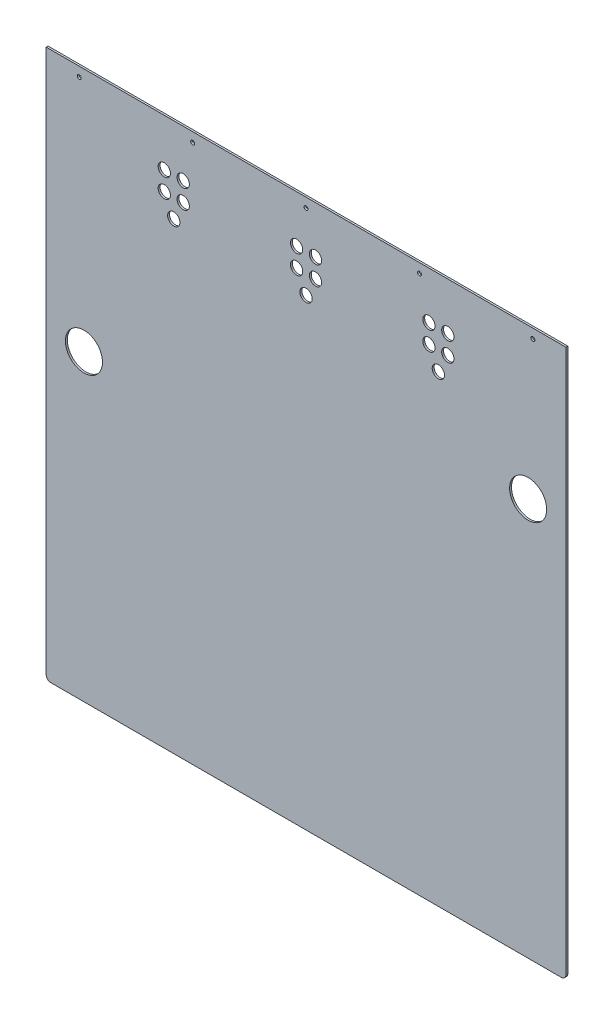
ISO-10303-21;
HEADER;
FILE_DESCRIPTION(('STEP AP214'),'2;1');
FILE_NAME('part.step','',(''),(''),'','','');
FILE_SCHEMA(('AUTOMOTIVE_DESIGN { 1 0 10303 214 1 1 1 1 }'));
ENDSEC;
DATA;
#1=APPLICATION_CONTEXT('core data for automotive mechanical design processes');
#2=APPLICATION_PROTOCOL_DEFINITION('international standard','automotive_design',2000,#1);
#3=PRODUCT_CONTEXT('',#1,'mechanical');
#4=PRODUCT('Part','Part','',(#3));
#5=PRODUCT_RELATED_PRODUCT_CATEGORY('part','',(#4));
#6=PRODUCT_DEFINITION_FORMATION('','',#4);
#7=PRODUCT_DEFINITION_CONTEXT('part definition',#1,'design');
#8=PRODUCT_DEFINITION('design','',#6,#7);
#9=PRODUCT_DEFINITION_SHAPE('','',#8);
#10=(LENGTH_UNIT() NAMED_UNIT(*) SI_UNIT(.MILLI.,.METRE.));
#11=(NAMED_UNIT(*) PLANE_ANGLE_UNIT() SI_UNIT($,.RADIAN.));
#12=(NAMED_UNIT(*) SI_UNIT($,.STERADIAN.) SOLID_ANGLE_UNIT());
#13=UNCERTAINTY_MEASURE_WITH_UNIT(LENGTH_MEASURE(1.E-05),#10,'distance_accuracy_value','');
#14=(GEOMETRIC_REPRESENTATION_CONTEXT(3) GLOBAL_UNCERTAINTY_ASSIGNED_CONTEXT((#13)) GLOBAL_UNIT_ASSIGNED_CONTEXT((#10,
#11,#12)) REPRESENTATION_CONTEXT('',''));
#15=CARTESIAN_POINT('',(0.,0.,0.));
#16=DIRECTION('',(0.,0.,1.));
#17=DIRECTION('',(1.,0.,0.));
#18=AXIS2_PLACEMENT_3D('',#15,#16,#17);
#19=CARTESIAN_POINT('',(0.,0.,-2.));
#20=DIRECTION('',(0.,0.,-1.));
#21=DIRECTION('',(-1.,0.,0.));
#22=AXIS2_PLACEMENT_3D('',#19,#20,#21);
#23=PLANE('',#22);
#24=CARTESIAN_POINT('',(140.,199.999999999999,-2.));
#25=DIRECTION('',(0.,0.,-1.));
#26=DIRECTION('',(-1.,0.,0.));
#27=AXIS2_PLACEMENT_3D('',#24,#25,#26);
#28=CIRCLE('',#27,6.49999999999999);
#29=CARTESIAN_POINT('',(133.5,199.999999999999,-2.));
#30=VERTEX_POINT('',#29);
#31=EDGE_CURVE('E505',#30,#30,#28,.T.);
#32=ORIENTED_EDGE('',*,*,#31,.F.);
#33=EDGE_LOOP('',(#32));
#34=FACE_BOUND('',#33,.T.);
#35=CARTESIAN_POINT('',(-140.,200.,-2.));
#36=DIRECTION('',(0.,0.,-1.));
#37=DIRECTION('',(-1.,0.,0.));
#38=AXIS2_PLACEMENT_3D('',#35,#36,#37);
#39=CIRCLE('',#38,6.49999999999999);
#40=CARTESIAN_POINT('',(-146.5,200.,-2.));
#41=VERTEX_POINT('',#40);
#42=EDGE_CURVE('E509',#41,#41,#39,.T.);
#43=ORIENTED_EDGE('',*,*,#42,.F.);
#44=EDGE_LOOP('',(#43));
#45=FACE_BOUND('',#44,.T.);
#46=CARTESIAN_POINT('',(0.,200.,-2.));
#47=DIRECTION('',(0.,0.,-1.));
#48=DIRECTION('',(-1.,0.,0.));
#49=AXIS2_PLACEMENT_3D('',#46,#47,#48);
#50=CIRCLE('',#49,6.5);
#51=CARTESIAN_POINT('',(-6.49999999999995,200.,-2.));
#52=VERTEX_POINT('',#51);
#53=EDGE_CURVE('E517',#52,#52,#50,.T.);
#54=ORIENTED_EDGE('',*,*,#53,.F.);
#55=EDGE_LOOP('',(#54));
#56=FACE_BOUND('',#55,.T.);
#57=CARTESIAN_POINT('',(-130.,220.,-2.));
#58=DIRECTION('',(0.,0.,-1.));
#59=DIRECTION('',(-1.,0.,0.));
#60=AXIS2_PLACEMENT_3D('',#57,#58,#59);
#61=CIRCLE('',#60,6.50000000000002);
#62=CARTESIAN_POINT('',(-136.5,220.,-2.));
#63=VERTEX_POINT('',#62);
#64=EDGE_CURVE('E558',#63,#63,#61,.F.);
#65=ORIENTED_EDGE('',*,*,#64,.T.);
#66=EDGE_LOOP('',(#65));
#67=FACE_BOUND('',#66,.T.);
#68=CARTESIAN_POINT('',(9.99999999999999,220.,-2.));
#69=DIRECTION('',(0.,0.,-1.));
#70=DIRECTION('',(-1.,0.,0.));
#71=AXIS2_PLACEMENT_3D('',#68,#69,#70);
#72=CIRCLE('',#71,6.50000000000001);
#73=CARTESIAN_POINT('',(3.49999999999999,220.,-2.));
#74=VERTEX_POINT('',#73);
#75=EDGE_CURVE('E552',#74,#74,#72,.F.);
#76=ORIENTED_EDGE('',*,*,#75,.T.);
#77=EDGE_LOOP('',(#76));
#78=FACE_BOUND('',#77,.T.);
#79=CARTESIAN_POINT('',(150.,220.,-2.));
#80=DIRECTION('',(0.,0.,-1.));
#81=DIRECTION('',(-1.,0.,0.));
#82=AXIS2_PLACEMENT_3D('',#79,#80,#81);
#83=CIRCLE('',#82,6.49999999999999);
#84=CARTESIAN_POINT('',(143.5,220.,-2.));
#85=VERTEX_POINT('',#84);
#86=EDGE_CURVE('E573',#85,#85,#83,.F.);
#87=ORIENTED_EDGE('',*,*,#86,.T.);
#88=EDGE_LOOP('',(#87));
#89=FACE_BOUND('',#88,.T.);
#90=CARTESIAN_POINT('',(-130.,240.,-2.));
#91=DIRECTION('',(0.,0.,-1.));
#92=DIRECTION('',(-1.,0.,0.));
#93=AXIS2_PLACEMENT_3D('',#90,#91,#92);
#94=CIRCLE('',#93,6.50000000000002);
#95=CARTESIAN_POINT('',(-136.5,240.,-2.));
#96=VERTEX_POINT('',#95);
#97=EDGE_CURVE('E534',#96,#96,#94,.F.);
#98=ORIENTED_EDGE('',*,*,#97,.T.);
#99=EDGE_LOOP('',(#98));
#100=FACE_BOUND('',#99,.T.);
#101=CARTESIAN_POINT('',(9.99999999999999,240.,-2.));
#102=DIRECTION('',(0.,0.,1.));
#103=DIRECTION('',(1.,0.,0.));
#104=AXIS2_PLACEMENT_3D('',#101,#102,#103);
#105=CIRCLE('',#104,6.50000000000001);
#106=CARTESIAN_POINT('',(16.5,240.,-2.));
#107=VERTEX_POINT('',#106);
#108=EDGE_CURVE('E523',#107,#107,#105,.T.);
#109=ORIENTED_EDGE('',*,*,#108,.T.);
#110=EDGE_LOOP('',(#109));
#111=FACE_BOUND('',#110,.T.);
#112=CARTESIAN_POINT('',(150.,240.,-2.));
#113=DIRECTION('',(0.,0.,-1.));
#114=DIRECTION('',(-1.,0.,0.));
#115=AXIS2_PLACEMENT_3D('',#112,#113,#114);
#116=CIRCLE('',#115,6.49999999999999);
#117=CARTESIAN_POINT('',(143.5,240.,-2.));
#118=VERTEX_POINT('',#117);
#119=EDGE_CURVE('E590',#118,#118,#116,.F.);
#120=ORIENTED_EDGE('',*,*,#119,.T.);
#121=EDGE_LOOP('',(#120));
#122=FACE_BOUND('',#121,.T.);
#123=CARTESIAN_POINT('',(-120.,280.,-2.));
#124=DIRECTION('',(0.,0.,-1.));
#125=DIRECTION('',(-1.,0.,0.));
#126=AXIS2_PLACEMENT_3D('',#123,#124,#125);
#127=CIRCLE('',#126,2.1);
#128=CARTESIAN_POINT('',(-122.1,280.,-2.));
#129=VERTEX_POINT('',#128);
#130=EDGE_CURVE('E593',#129,#129,#127,.F.);
#131=ORIENTED_EDGE('',*,*,#130,.T.);
#132=EDGE_LOOP('',(#131));
#133=FACE_BOUND('',#132,.T.);
#134=CARTESIAN_POINT('',(-240.,280.,-2.));
#135=DIRECTION('',(0.,0.,-1.));
#136=DIRECTION('',(-1.,0.,0.));
#137=AXIS2_PLACEMENT_3D('',#134,#135,#136);
#138=CIRCLE('',#137,2.09999999999999);
#139=CARTESIAN_POINT('',(-242.1,280.,-2.));
#140=VERTEX_POINT('',#139);
#141=EDGE_CURVE('E612',#140,#140,#138,.F.);
#142=ORIENTED_EDGE('',*,*,#141,.T.);
#143=EDGE_LOOP('',(#142));
#144=FACE_BOUND('',#143,.T.);
#145=CARTESIAN_POINT('',(240.,280.,-2.));
#146=DIRECTION('',(0.,0.,-1.));
#147=DIRECTION('',(-1.,0.,0.));
#148=AXIS2_PLACEMENT_3D('',#145,#146,#147);
#149=CIRCLE('',#148,2.09999999999999);
#150=CARTESIAN_POINT('',(237.9,280.,-2.));
#151=VERTEX_POINT('',#150);
#152=EDGE_CURVE('E606',#151,#151,#149,.F.);
#153=ORIENTED_EDGE('',*,*,#152,.T.);
#154=EDGE_LOOP('',(#153));
#155=FACE_BOUND('',#154,.T.);
#156=CARTESIAN_POINT('',(120.,280.,-2.));
#157=DIRECTION('',(0.,0.,-1.));
#158=DIRECTION('',(-1.,0.,0.));
#159=AXIS2_PLACEMENT_3D('',#156,#157,#158);
#160=CIRCLE('',#159,2.1);
#161=CARTESIAN_POINT('',(117.9,280.,-2.));
#162=VERTEX_POINT('',#161);
#163=EDGE_CURVE('E600',#162,#162,#160,.F.);
#164=ORIENTED_EDGE('',*,*,#163,.T.);
#165=EDGE_LOOP('',(#164));
#166=FACE_BOUND('',#165,.T.);
#167=CARTESIAN_POINT('',(0.,280.,-2.));
#168=DIRECTION('',(0.,0.,-1.));
#169=DIRECTION('',(-1.,0.,0.));
#170=AXIS2_PLACEMENT_3D('',#167,#168,#169);
#171=CIRCLE('',#170,2.1);
#172=CARTESIAN_POINT('',(-2.1,280.,-2.));
#173=VERTEX_POINT('',#172);
#174=EDGE_CURVE('E599',#173,#173,#171,.F.);
#175=ORIENTED_EDGE('',*,*,#174,.T.);
#176=EDGE_LOOP('',(#175));
#177=FACE_BOUND('',#176,.T.);
#178=CARTESIAN_POINT('',(-235.,31.,-2.));
#179=DIRECTION('',(0.,0.,-1.));
#180=DIRECTION('',(-1.,0.,0.));
#181=AXIS2_PLACEMENT_3D('',#178,#179,#180);
#182=CIRCLE('',#181,19.6);
#183=CARTESIAN_POINT('',(-254.6,31.,-2.));
#184=VERTEX_POINT('',#183);
#185=EDGE_CURVE('E628',#184,#184,#182,.F.);
#186=ORIENTED_EDGE('',*,*,#185,.T.);
#187=EDGE_LOOP('',(#186));
#188=FACE_BOUND('',#187,.T.);
#189=CARTESIAN_POINT('',(235.,131.,-2.));
#190=DIRECTION('',(0.,0.,-1.));
#191=DIRECTION('',(-1.,0.,0.));
#192=AXIS2_PLACEMENT_3D('',#189,#190,#191);
#193=CIRCLE('',#192,19.6);
#194=CARTESIAN_POINT('',(215.4,131.,-2.));
#195=VERTEX_POINT('',#194);
#196=EDGE_CURVE('E623',#195,#195,#193,.F.);
#197=ORIENTED_EDGE('',*,*,#196,.T.);
#198=EDGE_LOOP('',(#197));
#199=FACE_BOUND('',#198,.T.);
#200=DIRECTION('',(1.,0.,0.));
#201=VECTOR('',#200,1.);
#202=CARTESIAN_POINT('',(-275.,-290.,-2.));
#203=LINE('',#202,#201);
#204=CARTESIAN_POINT('',(-270.,-290.,-2.));
#205=VERTEX_POINT('',#204);
#206=CARTESIAN_POINT('',(270.,-290.,-2.));
#207=VERTEX_POINT('',#206);
#208=EDGE_CURVE('E103',#205,#207,#203,.T.);
#209=ORIENTED_EDGE('',*,*,#208,.F.);
#210=CARTESIAN_POINT('',(-270.,-285.,-2.));
#211=DIRECTION('',(0.,0.,-1.));
#212=DIRECTION('',(-1.,0.,0.));
#213=AXIS2_PLACEMENT_3D('',#210,#211,#212);
#214=CIRCLE('',#213,5.);
#215=CARTESIAN_POINT('',(-275.,-285.,-2.));
#216=VERTEX_POINT('',#215);
#217=EDGE_CURVE('E45',#205,#216,#214,.T.);
#218=ORIENTED_EDGE('',*,*,#217,.T.);
#219=DIRECTION('',(0.,-1.,0.));
#220=VECTOR('',#219,1.);
#221=CARTESIAN_POINT('',(-275.,-290.,-2.));
#222=LINE('',#221,#220);
#223=CARTESIAN_POINT('',(-275.,290.,-2.));
#224=VERTEX_POINT('',#223);
#225=EDGE_CURVE('E108',#224,#216,#222,.T.);
#226=ORIENTED_EDGE('',*,*,#225,.F.);
#227=DIRECTION('',(-1.,0.,0.));
#228=VECTOR('',#227,1.);
#229=CARTESIAN_POINT('',(-275.,290.,-2.));
#230=LINE('',#229,#228);
#231=CARTESIAN_POINT('',(275.,290.,-2.));
#232=VERTEX_POINT('',#231);
#233=EDGE_CURVE('E94',#232,#224,#230,.T.);
#234=ORIENTED_EDGE('',*,*,#233,.F.);
#235=DIRECTION('',(0.,1.,0.));
#236=VECTOR('',#235,1.);
#237=CARTESIAN_POINT('',(275.,-290.,-2.));
#238=LINE('',#237,#236);
#239=CARTESIAN_POINT('',(275.,-285.,-2.));
#240=VERTEX_POINT('',#239);
#241=EDGE_CURVE('E88',#240,#232,#238,.T.);
#242=ORIENTED_EDGE('',*,*,#241,.F.);
#243=CARTESIAN_POINT('',(270.,-285.,-2.));
#244=DIRECTION('',(0.,0.,-1.));
#245=DIRECTION('',(-1.,0.,0.));
#246=AXIS2_PLACEMENT_3D('',#243,#244,#245);
#247=CIRCLE('',#246,5.);
#248=EDGE_CURVE('E57',#240,#207,#247,.T.);
#249=ORIENTED_EDGE('',*,*,#248,.T.);
#250=EDGE_LOOP('',(#209,#218,#226,#234,#242,#249));
#251=FACE_BOUND('',#250,.T.);
#252=CARTESIAN_POINT('',(-150.,240.,-2.));
#253=DIRECTION('',(0.,0.,-1.));
#254=DIRECTION('',(-1.,0.,0.));
#255=AXIS2_PLACEMENT_3D('',#252,#253,#254);
#256=CIRCLE('',#255,6.49999999999999);
#257=CARTESIAN_POINT('',(-156.5,240.,-2.));
#258=VERTEX_POINT('',#257);
#259=EDGE_CURVE('E527',#258,#258,#256,.T.);
#260=ORIENTED_EDGE('',*,*,#259,.F.);
#261=EDGE_LOOP('',(#260));
#262=FACE_BOUND('',#261,.T.);
#263=CARTESIAN_POINT('',(-10.,240.,-2.));
#264=DIRECTION('',(0.,0.,-1.));
#265=DIRECTION('',(-1.,0.,0.));
#266=AXIS2_PLACEMENT_3D('',#263,#264,#265);
#267=CIRCLE('',#266,6.50000000000001);
#268=CARTESIAN_POINT('',(-16.5,240.,-2.));
#269=VERTEX_POINT('',#268);
#270=EDGE_CURVE('E570',#269,#269,#267,.T.);
#271=ORIENTED_EDGE('',*,*,#270,.F.);
#272=EDGE_LOOP('',(#271));
#273=FACE_BOUND('',#272,.T.);
#274=CARTESIAN_POINT('',(130.,220.,-2.));
#275=DIRECTION('',(0.,0.,-1.));
#276=DIRECTION('',(-1.,0.,0.));
#277=AXIS2_PLACEMENT_3D('',#274,#275,#276);
#278=CIRCLE('',#277,6.49999999999999);
#279=CARTESIAN_POINT('',(123.5,220.,-2.));
#280=VERTEX_POINT('',#279);
#281=EDGE_CURVE('E569',#280,#280,#278,.T.);
#282=ORIENTED_EDGE('',*,*,#281,.F.);
#283=EDGE_LOOP('',(#282));
#284=FACE_BOUND('',#283,.T.);
#285=CARTESIAN_POINT('',(130.,240.,-2.));
#286=DIRECTION('',(0.,0.,-1.));
#287=DIRECTION('',(-1.,0.,0.));
#288=AXIS2_PLACEMENT_3D('',#285,#286,#287);
#289=CIRCLE('',#288,6.49999999999999);
#290=CARTESIAN_POINT('',(123.5,240.,-2.));
#291=VERTEX_POINT('',#290);
#292=EDGE_CURVE('E581',#291,#291,#289,.T.);
#293=ORIENTED_EDGE('',*,*,#292,.F.);
#294=EDGE_LOOP('',(#293));
#295=FACE_BOUND('',#294,.T.);
#296=CARTESIAN_POINT('',(-10.,220.,-2.));
#297=DIRECTION('',(0.,0.,-1.));
#298=DIRECTION('',(-1.,0.,0.));
#299=AXIS2_PLACEMENT_3D('',#296,#297,#298);
#300=CIRCLE('',#299,6.50000000000001);
#301=CARTESIAN_POINT('',(-16.5,220.,-2.));
#302=VERTEX_POINT('',#301);
#303=EDGE_CURVE('E545',#302,#302,#300,.T.);
#304=ORIENTED_EDGE('',*,*,#303,.F.);
#305=EDGE_LOOP('',(#304));
#306=FACE_BOUND('',#305,.T.);
#307=CARTESIAN_POINT('',(-150.,220.,-2.));
#308=DIRECTION('',(0.,0.,-1.));
#309=DIRECTION('',(-1.,0.,0.));
#310=AXIS2_PLACEMENT_3D('',#307,#308,#309);
#311=CIRCLE('',#310,6.49999999999999);
#312=CARTESIAN_POINT('',(-156.5,220.,-2.));
#313=VERTEX_POINT('',#312);
#314=EDGE_CURVE('E561',#313,#313,#311,.T.);
#315=ORIENTED_EDGE('',*,*,#314,.F.);
#316=EDGE_LOOP('',(#315));
#317=FACE_BOUND('',#316,.T.);
#318=ADVANCED_FACE('F37',(#34,#45,#56,#67,#78,#89,#100,#111,#122,#133,#144,#155,#166,#177,#188,
#199,#251,#262,#273,#284,#295,#306,#317),#23,.T.);
#319=CARTESIAN_POINT('',(0.,0.,0.));
#320=DIRECTION('',(0.,0.,-1.));
#321=DIRECTION('',(-1.,0.,0.));
#322=AXIS2_PLACEMENT_3D('',#319,#320,#321);
#323=PLANE('',#322);
#324=CARTESIAN_POINT('',(140.,199.999999999999,0.));
#325=DIRECTION('',(0.,0.,-1.));
#326=DIRECTION('',(-1.,0.,0.));
#327=AXIS2_PLACEMENT_3D('',#324,#325,#326);
#328=CIRCLE('',#327,6.49999999999999);
#329=CARTESIAN_POINT('',(133.5,199.999999999999,0.));
#330=VERTEX_POINT('',#329);
#331=EDGE_CURVE('E508',#330,#330,#328,.F.);
#332=ORIENTED_EDGE('',*,*,#331,.F.);
#333=EDGE_LOOP('',(#332));
#334=FACE_BOUND('',#333,.T.);
#335=CARTESIAN_POINT('',(-140.,200.,0.));
#336=DIRECTION('',(0.,0.,-1.));
#337=DIRECTION('',(-1.,0.,0.));
#338=AXIS2_PLACEMENT_3D('',#335,#336,#337);
#339=CIRCLE('',#338,6.49999999999999);
#340=CARTESIAN_POINT('',(-146.5,200.,0.));
#341=VERTEX_POINT('',#340);
#342=EDGE_CURVE('E512',#341,#341,#339,.F.);
#343=ORIENTED_EDGE('',*,*,#342,.F.);
#344=EDGE_LOOP('',(#343));
#345=FACE_BOUND('',#344,.T.);
#346=CARTESIAN_POINT('',(0.,200.,0.));
#347=DIRECTION('',(0.,0.,-1.));
#348=DIRECTION('',(-1.,0.,0.));
#349=AXIS2_PLACEMENT_3D('',#346,#347,#348);
#350=CIRCLE('',#349,6.5);
#351=CARTESIAN_POINT('',(-6.49999999999995,200.,0.));
#352=VERTEX_POINT('',#351);
#353=EDGE_CURVE('E520',#352,#352,#350,.F.);
#354=ORIENTED_EDGE('',*,*,#353,.F.);
#355=EDGE_LOOP('',(#354));
#356=FACE_BOUND('',#355,.T.);
#357=CARTESIAN_POINT('',(-10.,220.,0.));
#358=DIRECTION('',(0.,0.,-1.));
#359=DIRECTION('',(-1.,0.,0.));
#360=AXIS2_PLACEMENT_3D('',#357,#358,#359);
#361=CIRCLE('',#360,6.50000000000001);
#362=CARTESIAN_POINT('',(-16.5,220.,0.));
#363=VERTEX_POINT('',#362);
#364=EDGE_CURVE('E542',#363,#363,#361,.F.);
#365=ORIENTED_EDGE('',*,*,#364,.F.);
#366=EDGE_LOOP('',(#365));
#367=FACE_BOUND('',#366,.T.);
#368=CARTESIAN_POINT('',(130.,220.,0.));
#369=DIRECTION('',(0.,0.,-1.));
#370=DIRECTION('',(-1.,0.,0.));
#371=AXIS2_PLACEMENT_3D('',#368,#369,#370);
#372=CIRCLE('',#371,6.49999999999999);
#373=CARTESIAN_POINT('',(123.5,220.,0.));
#374=VERTEX_POINT('',#373);
#375=EDGE_CURVE('E566',#374,#374,#372,.F.);
#376=ORIENTED_EDGE('',*,*,#375,.F.);
#377=EDGE_LOOP('',(#376));
#378=FACE_BOUND('',#377,.T.);
#379=CARTESIAN_POINT('',(-150.,240.,0.));
#380=DIRECTION('',(0.,0.,-1.));
#381=DIRECTION('',(-1.,0.,0.));
#382=AXIS2_PLACEMENT_3D('',#379,#380,#381);
#383=CIRCLE('',#382,6.49999999999999);
#384=CARTESIAN_POINT('',(-156.5,240.,0.));
#385=VERTEX_POINT('',#384);
#386=EDGE_CURVE('E524',#385,#385,#383,.F.);
#387=ORIENTED_EDGE('',*,*,#386,.F.);
#388=EDGE_LOOP('',(#387));
#389=FACE_BOUND('',#388,.T.);
#390=CARTESIAN_POINT('',(-130.,240.,0.));
#391=DIRECTION('',(0.,0.,-1.));
#392=DIRECTION('',(-1.,0.,0.));
#393=AXIS2_PLACEMENT_3D('',#390,#391,#392);
#394=CIRCLE('',#393,6.50000000000002);
#395=CARTESIAN_POINT('',(-136.5,240.,0.));
#396=VERTEX_POINT('',#395);
#397=EDGE_CURVE('E528',#396,#396,#394,.T.);
#398=ORIENTED_EDGE('',*,*,#397,.T.);
#399=EDGE_LOOP('',(#398));
#400=FACE_BOUND('',#399,.T.);
#401=CARTESIAN_POINT('',(9.99999999999999,240.,0.));
#402=DIRECTION('',(0.,0.,-1.));
#403=DIRECTION('',(-1.,0.,0.));
#404=AXIS2_PLACEMENT_3D('',#401,#402,#403);
#405=CIRCLE('',#404,6.50000000000001);
#406=CARTESIAN_POINT('',(3.49999999999999,240.,0.));
#407=VERTEX_POINT('',#406);
#408=EDGE_CURVE('E537',#407,#407,#405,.T.);
#409=ORIENTED_EDGE('',*,*,#408,.T.);
#410=EDGE_LOOP('',(#409));
#411=FACE_BOUND('',#410,.T.);
#412=CARTESIAN_POINT('',(150.,240.,0.));
#413=DIRECTION('',(0.,0.,-1.));
#414=DIRECTION('',(-1.,0.,0.));
#415=AXIS2_PLACEMENT_3D('',#412,#413,#414);
#416=CIRCLE('',#415,6.49999999999999);
#417=CARTESIAN_POINT('',(143.5,240.,0.));
#418=VERTEX_POINT('',#417);
#419=EDGE_CURVE('E585',#418,#418,#416,.T.);
#420=ORIENTED_EDGE('',*,*,#419,.T.);
#421=EDGE_LOOP('',(#420));
#422=FACE_BOUND('',#421,.T.);
#423=CARTESIAN_POINT('',(-120.,280.,0.));
#424=DIRECTION('',(0.,0.,1.));
#425=DIRECTION('',(-1.,0.,0.));
#426=AXIS2_PLACEMENT_3D('',#423,#424,#425);
#427=CIRCLE('',#426,2.1);
#428=CARTESIAN_POINT('',(-122.1,280.,0.));
#429=VERTEX_POINT('',#428);
#430=EDGE_CURVE('E615',#429,#429,#427,.T.);
#431=ORIENTED_EDGE('',*,*,#430,.F.);
#432=EDGE_LOOP('',(#431));
#433=FACE_BOUND('',#432,.T.);
#434=CARTESIAN_POINT('',(-240.,280.,0.));
#435=DIRECTION('',(0.,0.,1.));
#436=DIRECTION('',(-1.,0.,0.));
#437=AXIS2_PLACEMENT_3D('',#434,#435,#436);
#438=CIRCLE('',#437,2.09999999999999);
#439=CARTESIAN_POINT('',(-242.1,280.,0.));
#440=VERTEX_POINT('',#439);
#441=EDGE_CURVE('E609',#440,#440,#438,.T.);
#442=ORIENTED_EDGE('',*,*,#441,.F.);
#443=EDGE_LOOP('',(#442));
#444=FACE_BOUND('',#443,.T.);
#445=CARTESIAN_POINT('',(240.,280.,0.));
#446=DIRECTION('',(0.,0.,1.));
#447=DIRECTION('',(1.,0.,0.));
#448=AXIS2_PLACEMENT_3D('',#445,#446,#447);
#449=CIRCLE('',#448,2.09999999999999);
#450=CARTESIAN_POINT('',(242.1,280.,0.));
#451=VERTEX_POINT('',#450);
#452=EDGE_CURVE('E603',#451,#451,#449,.T.);
#453=ORIENTED_EDGE('',*,*,#452,.F.);
#454=EDGE_LOOP('',(#453));
#455=FACE_BOUND('',#454,.T.);
#456=CARTESIAN_POINT('',(120.,280.,0.));
#457=DIRECTION('',(0.,0.,1.));
#458=DIRECTION('',(1.,0.,0.));
#459=AXIS2_PLACEMENT_3D('',#456,#457,#458);
#460=CIRCLE('',#459,2.1);
#461=CARTESIAN_POINT('',(122.1,280.,0.));
#462=VERTEX_POINT('',#461);
#463=EDGE_CURVE('E596',#462,#462,#460,.T.);
#464=ORIENTED_EDGE('',*,*,#463,.F.);
#465=EDGE_LOOP('',(#464));
#466=FACE_BOUND('',#465,.T.);
#467=CARTESIAN_POINT('',(0.,280.,0.));
#468=DIRECTION('',(0.,0.,1.));
#469=DIRECTION('',(1.,0.,0.));
#470=AXIS2_PLACEMENT_3D('',#467,#468,#469);
#471=CIRCLE('',#470,2.1);
#472=CARTESIAN_POINT('',(2.1,280.,0.));
#473=VERTEX_POINT('',#472);
#474=EDGE_CURVE('E620',#473,#473,#471,.T.);
#475=ORIENTED_EDGE('',*,*,#474,.F.);
#476=EDGE_LOOP('',(#475));
#477=FACE_BOUND('',#476,.T.);
#478=CARTESIAN_POINT('',(-235.,31.,0.));
#479=DIRECTION('',(0.,0.,1.));
#480=DIRECTION('',(1.,0.,0.));
#481=AXIS2_PLACEMENT_3D('',#478,#479,#480);
#482=CIRCLE('',#481,19.6);
#483=CARTESIAN_POINT('',(-215.4,31.,0.));
#484=VERTEX_POINT('',#483);
#485=EDGE_CURVE('E116',#484,#484,#482,.T.);
#486=ORIENTED_EDGE('',*,*,#485,.F.);
#487=EDGE_LOOP('',(#486));
#488=FACE_BOUND('',#487,.T.);
#489=CARTESIAN_POINT('',(235.,131.,0.));
#490=DIRECTION('',(0.,0.,1.));
#491=DIRECTION('',(1.,0.,0.));
#492=AXIS2_PLACEMENT_3D('',#489,#490,#491);
#493=CIRCLE('',#492,19.6);
#494=CARTESIAN_POINT('',(254.6,131.,0.));
#495=VERTEX_POINT('',#494);
#496=EDGE_CURVE('E631',#495,#495,#493,.T.);
#497=ORIENTED_EDGE('',*,*,#496,.F.);
#498=EDGE_LOOP('',(#497));
#499=FACE_BOUND('',#498,.T.);
#500=DIRECTION('',(0.,-1.,0.));
#501=VECTOR('',#500,1.);
#502=CARTESIAN_POINT('',(-275.,-290.,0.));
#503=LINE('',#502,#501);
#504=CARTESIAN_POINT('',(-275.,290.,0.));
#505=VERTEX_POINT('',#504);
#506=CARTESIAN_POINT('',(-275.,-285.,0.));
#507=VERTEX_POINT('',#506);
#508=EDGE_CURVE('E118',#505,#507,#503,.T.);
#509=ORIENTED_EDGE('',*,*,#508,.T.);
#510=CARTESIAN_POINT('',(-270.,-285.,0.));
#511=DIRECTION('',(0.,0.,-1.));
#512=DIRECTION('',(-1.,0.,0.));
#513=AXIS2_PLACEMENT_3D('',#510,#511,#512);
#514=CIRCLE('',#513,5.);
#515=CARTESIAN_POINT('',(-270.,-290.,0.));
#516=VERTEX_POINT('',#515);
#517=EDGE_CURVE('E129',#507,#516,#514,.F.);
#518=ORIENTED_EDGE('',*,*,#517,.T.);
#519=DIRECTION('',(1.,0.,0.));
#520=VECTOR('',#519,1.);
#521=CARTESIAN_POINT('',(-275.,-290.,0.));
#522=LINE('',#521,#520);
#523=CARTESIAN_POINT('',(270.,-290.,0.));
#524=VERTEX_POINT('',#523);
#525=EDGE_CURVE('E95',#516,#524,#522,.T.);
#526=ORIENTED_EDGE('',*,*,#525,.T.);
#527=CARTESIAN_POINT('',(270.,-285.,0.));
#528=DIRECTION('',(0.,0.,-1.));
#529=DIRECTION('',(-1.,0.,0.));
#530=AXIS2_PLACEMENT_3D('',#527,#528,#529);
#531=CIRCLE('',#530,5.);
#532=CARTESIAN_POINT('',(275.,-285.,0.));
#533=VERTEX_POINT('',#532);
#534=EDGE_CURVE('E127',#524,#533,#531,.F.);
#535=ORIENTED_EDGE('',*,*,#534,.T.);
#536=DIRECTION('',(0.,1.,0.));
#537=VECTOR('',#536,1.);
#538=CARTESIAN_POINT('',(275.,-290.,0.));
#539=LINE('',#538,#537);
#540=CARTESIAN_POINT('',(275.,290.,0.));
#541=VERTEX_POINT('',#540);
#542=EDGE_CURVE('E114',#533,#541,#539,.T.);
#543=ORIENTED_EDGE('',*,*,#542,.T.);
#544=DIRECTION('',(-1.,0.,0.));
#545=VECTOR('',#544,1.);
#546=CARTESIAN_POINT('',(-275.,290.,0.));
#547=LINE('',#546,#545);
#548=EDGE_CURVE('E101',#541,#505,#547,.T.);
#549=ORIENTED_EDGE('',*,*,#548,.T.);
#550=EDGE_LOOP('',(#509,#518,#526,#535,#543,#549));
#551=FACE_BOUND('',#550,.T.);
#552=CARTESIAN_POINT('',(-10.,240.,0.));
#553=DIRECTION('',(0.,0.,-1.));
#554=DIRECTION('',(-1.,0.,0.));
#555=AXIS2_PLACEMENT_3D('',#552,#553,#554);
#556=CIRCLE('',#555,6.50000000000001);
#557=CARTESIAN_POINT('',(-16.5,240.,0.));
#558=VERTEX_POINT('',#557);
#559=EDGE_CURVE('E549',#558,#558,#556,.F.);
#560=ORIENTED_EDGE('',*,*,#559,.F.);
#561=EDGE_LOOP('',(#560));
#562=FACE_BOUND('',#561,.T.);
#563=CARTESIAN_POINT('',(150.,220.,0.));
#564=DIRECTION('',(0.,0.,-1.));
#565=DIRECTION('',(-1.,0.,0.));
#566=AXIS2_PLACEMENT_3D('',#563,#564,#565);
#567=CIRCLE('',#566,6.49999999999999);
#568=CARTESIAN_POINT('',(143.5,220.,0.));
#569=VERTEX_POINT('',#568);
#570=EDGE_CURVE('E582',#569,#569,#567,.T.);
#571=ORIENTED_EDGE('',*,*,#570,.T.);
#572=EDGE_LOOP('',(#571));
#573=FACE_BOUND('',#572,.T.);
#574=CARTESIAN_POINT('',(130.,240.,0.));
#575=DIRECTION('',(0.,0.,-1.));
#576=DIRECTION('',(-1.,0.,0.));
#577=AXIS2_PLACEMENT_3D('',#574,#575,#576);
#578=CIRCLE('',#577,6.49999999999999);
#579=CARTESIAN_POINT('',(123.5,240.,0.));
#580=VERTEX_POINT('',#579);
#581=EDGE_CURVE('E578',#580,#580,#578,.F.);
#582=ORIENTED_EDGE('',*,*,#581,.F.);
#583=EDGE_LOOP('',(#582));
#584=FACE_BOUND('',#583,.T.);
#585=CARTESIAN_POINT('',(9.99999999999999,220.,0.));
#586=DIRECTION('',(0.,0.,-1.));
#587=DIRECTION('',(-1.,0.,0.));
#588=AXIS2_PLACEMENT_3D('',#585,#586,#587);
#589=CIRCLE('',#588,6.50000000000001);
#590=CARTESIAN_POINT('',(3.49999999999999,220.,0.));
#591=VERTEX_POINT('',#590);
#592=EDGE_CURVE('E546',#591,#591,#589,.T.);
#593=ORIENTED_EDGE('',*,*,#592,.T.);
#594=EDGE_LOOP('',(#593));
#595=FACE_BOUND('',#594,.T.);
#596=CARTESIAN_POINT('',(-130.,220.,0.));
#597=DIRECTION('',(0.,0.,-1.));
#598=DIRECTION('',(-1.,0.,0.));
#599=AXIS2_PLACEMENT_3D('',#596,#597,#598);
#600=CIRCLE('',#599,6.50000000000002);
#601=CARTESIAN_POINT('',(-136.5,220.,0.));
#602=VERTEX_POINT('',#601);
#603=EDGE_CURVE('E555',#602,#602,#600,.T.);
#604=ORIENTED_EDGE('',*,*,#603,.T.);
#605=EDGE_LOOP('',(#604));
#606=FACE_BOUND('',#605,.T.);
#607=CARTESIAN_POINT('',(-150.,220.,0.));
#608=DIRECTION('',(0.,0.,-1.));
#609=DIRECTION('',(-1.,0.,0.));
#610=AXIS2_PLACEMENT_3D('',#607,#608,#609);
#611=CIRCLE('',#610,6.49999999999999);
#612=CARTESIAN_POINT('',(-156.5,220.,0.));
#613=VERTEX_POINT('',#612);
#614=EDGE_CURVE('E531',#613,#613,#611,.F.);
#615=ORIENTED_EDGE('',*,*,#614,.F.);
#616=EDGE_LOOP('',(#615));
#617=FACE_BOUND('',#616,.T.);
#618=ADVANCED_FACE('F146',(#334,#345,#356,#367,#378,#389,#400,#411,#422,#433,#444,#455,#466,
#477,#488,#499,#551,#562,#573,#584,#595,#606,#617),#323,.F.);
#619=CARTESIAN_POINT('',(275.,-290.,-2.));
#620=DIRECTION('',(1.,0.,0.));
#621=DIRECTION('',(0.,0.,-1.));
#622=AXIS2_PLACEMENT_3D('',#619,#620,#621);
#623=PLANE('',#622);
#624=ORIENTED_EDGE('',*,*,#542,.F.);
#625=DIRECTION('',(0.,0.,1.));
#626=VECTOR('',#625,1.);
#627=CARTESIAN_POINT('',(275.,-285.,-2.));
#628=LINE('',#627,#626);
#629=EDGE_CURVE('E11',#533,#240,#628,.F.);
#630=ORIENTED_EDGE('',*,*,#629,.T.);
#631=ORIENTED_EDGE('',*,*,#241,.T.);
#632=DIRECTION('',(0.,0.,1.));
#633=VECTOR('',#632,1.);
#634=CARTESIAN_POINT('',(275.,290.,-2.));
#635=LINE('',#634,#633);
#636=EDGE_CURVE('E91',#232,#541,#635,.T.);
#637=ORIENTED_EDGE('',*,*,#636,.T.);
#638=EDGE_LOOP('',(#624,#630,#631,#637));
#639=FACE_BOUND('',#638,.T.);
#640=ADVANCED_FACE('F90',(#639),#623,.T.);
#641=CARTESIAN_POINT('',(-275.,-290.,-2.));
#642=DIRECTION('',(0.,-1.,0.));
#643=DIRECTION('',(0.,0.,-1.));
#644=AXIS2_PLACEMENT_3D('',#641,#642,#643);
#645=PLANE('',#644);
#646=ORIENTED_EDGE('',*,*,#525,.F.);
#647=DIRECTION('',(0.,0.,1.));
#648=VECTOR('',#647,1.);
#649=CARTESIAN_POINT('',(-270.,-290.,-2.));
#650=LINE('',#649,#648);
#651=EDGE_CURVE('E134',#516,#205,#650,.F.);
#652=ORIENTED_EDGE('',*,*,#651,.T.);
#653=ORIENTED_EDGE('',*,*,#208,.T.);
#654=DIRECTION('',(0.,0.,1.));
#655=VECTOR('',#654,1.);
#656=CARTESIAN_POINT('',(270.,-290.,-2.));
#657=LINE('',#656,#655);
#658=EDGE_CURVE('E131',#207,#524,#657,.T.);
#659=ORIENTED_EDGE('',*,*,#658,.T.);
#660=EDGE_LOOP('',(#646,#652,#653,#659));
#661=FACE_BOUND('',#660,.T.);
#662=ADVANCED_FACE('F149',(#661),#645,.T.);
#663=CARTESIAN_POINT('',(-275.,-290.,-2.));
#664=DIRECTION('',(-1.,0.,0.));
#665=DIRECTION('',(0.,0.,1.));
#666=AXIS2_PLACEMENT_3D('',#663,#664,#665);
#667=PLANE('',#666);
#668=ORIENTED_EDGE('',*,*,#225,.T.);
#669=DIRECTION('',(0.,0.,1.));
#670=VECTOR('',#669,1.);
#671=CARTESIAN_POINT('',(-275.,-285.,-2.));
#672=LINE('',#671,#670);
#673=EDGE_CURVE('E123',#216,#507,#672,.T.);
#674=ORIENTED_EDGE('',*,*,#673,.T.);
#675=ORIENTED_EDGE('',*,*,#508,.F.);
#676=DIRECTION('',(0.,0.,1.));
#677=VECTOR('',#676,1.);
#678=CARTESIAN_POINT('',(-275.,290.,-2.));
#679=LINE('',#678,#677);
#680=EDGE_CURVE('E102',#224,#505,#679,.T.);
#681=ORIENTED_EDGE('',*,*,#680,.F.);
#682=EDGE_LOOP('',(#668,#674,#675,#681));
#683=FACE_BOUND('',#682,.T.);
#684=ADVANCED_FACE('F141',(#683),#667,.T.);
#685=CARTESIAN_POINT('',(-275.,290.,-2.));
#686=DIRECTION('',(0.,1.,0.));
#687=DIRECTION('',(0.,0.,1.));
#688=AXIS2_PLACEMENT_3D('',#685,#686,#687);
#689=PLANE('',#688);
#690=ORIENTED_EDGE('',*,*,#548,.F.);
#691=ORIENTED_EDGE('',*,*,#636,.F.);
#692=ORIENTED_EDGE('',*,*,#233,.T.);
#693=ORIENTED_EDGE('',*,*,#680,.T.);
#694=EDGE_LOOP('',(#690,#691,#692,#693));
#695=FACE_BOUND('',#694,.T.);
#696=ADVANCED_FACE('F99',(#695),#689,.T.);
#697=CARTESIAN_POINT('',(-270.,-285.,-2.));
#698=DIRECTION('',(0.,0.,1.));
#699=DIRECTION('',(1.,0.,0.));
#700=AXIS2_PLACEMENT_3D('',#697,#698,#699);
#701=CYLINDRICAL_SURFACE('',#700,5.);
#702=ORIENTED_EDGE('',*,*,#217,.F.);
#703=ORIENTED_EDGE('',*,*,#651,.F.);
#704=ORIENTED_EDGE('',*,*,#517,.F.);
#705=ORIENTED_EDGE('',*,*,#673,.F.);
#706=EDGE_LOOP('',(#702,#703,#704,#705));
#707=FACE_BOUND('',#706,.T.);
#708=ADVANCED_FACE('F143',(#707),#701,.T.);
#709=CARTESIAN_POINT('',(270.,-285.,-2.));
#710=DIRECTION('',(0.,0.,1.));
#711=DIRECTION('',(1.,0.,0.));
#712=AXIS2_PLACEMENT_3D('',#709,#710,#711);
#713=CYLINDRICAL_SURFACE('',#712,5.);
#714=ORIENTED_EDGE('',*,*,#248,.F.);
#715=ORIENTED_EDGE('',*,*,#629,.F.);
#716=ORIENTED_EDGE('',*,*,#534,.F.);
#717=ORIENTED_EDGE('',*,*,#658,.F.);
#718=EDGE_LOOP('',(#714,#715,#716,#717));
#719=FACE_BOUND('',#718,.T.);
#720=ADVANCED_FACE('F39',(#719),#713,.T.);
#721=CARTESIAN_POINT('',(235.,131.,-2.001));
#722=DIRECTION('',(0.,0.,1.));
#723=DIRECTION('',(1.,0.,0.));
#724=AXIS2_PLACEMENT_3D('',#721,#722,#723);
#725=CYLINDRICAL_SURFACE('',#724,19.6);
#726=ORIENTED_EDGE('',*,*,#196,.F.);
#727=EDGE_LOOP('',(#726));
#728=FACE_BOUND('',#727,.T.);
#729=ORIENTED_EDGE('',*,*,#496,.T.);
#730=EDGE_LOOP('',(#729));
#731=FACE_BOUND('',#730,.T.);
#732=ADVANCED_FACE('F153',(#728,#731),#725,.F.);
#733=CARTESIAN_POINT('',(-235.,31.,-2.001));
#734=DIRECTION('',(0.,0.,1.));
#735=DIRECTION('',(1.,0.,0.));
#736=AXIS2_PLACEMENT_3D('',#733,#734,#735);
#737=CYLINDRICAL_SURFACE('',#736,19.6);
#738=ORIENTED_EDGE('',*,*,#185,.F.);
#739=EDGE_LOOP('',(#738));
#740=FACE_BOUND('',#739,.T.);
#741=ORIENTED_EDGE('',*,*,#485,.T.);
#742=EDGE_LOOP('',(#741));
#743=FACE_BOUND('',#742,.T.);
#744=ADVANCED_FACE('F158',(#740,#743),#737,.F.);
#745=CARTESIAN_POINT('',(0.,280.,-2.001));
#746=DIRECTION('',(0.,0.,1.));
#747=DIRECTION('',(1.,0.,0.));
#748=AXIS2_PLACEMENT_3D('',#745,#746,#747);
#749=CYLINDRICAL_SURFACE('',#748,2.1);
#750=ORIENTED_EDGE('',*,*,#174,.F.);
#751=EDGE_LOOP('',(#750));
#752=FACE_BOUND('',#751,.T.);
#753=ORIENTED_EDGE('',*,*,#474,.T.);
#754=EDGE_LOOP('',(#753));
#755=FACE_BOUND('',#754,.T.);
#756=ADVANCED_FACE('F220',(#752,#755),#749,.F.);
#757=CARTESIAN_POINT('',(120.,280.,-2.001));
#758=DIRECTION('',(0.,0.,1.));
#759=DIRECTION('',(1.,0.,0.));
#760=AXIS2_PLACEMENT_3D('',#757,#758,#759);
#761=CYLINDRICAL_SURFACE('',#760,2.1);
#762=ORIENTED_EDGE('',*,*,#163,.F.);
#763=EDGE_LOOP('',(#762));
#764=FACE_BOUND('',#763,.T.);
#765=ORIENTED_EDGE('',*,*,#463,.T.);
#766=EDGE_LOOP('',(#765));
#767=FACE_BOUND('',#766,.T.);
#768=ADVANCED_FACE('F230',(#764,#767),#761,.F.);
#769=CARTESIAN_POINT('',(240.,280.,-2.001));
#770=DIRECTION('',(0.,0.,1.));
#771=DIRECTION('',(1.,0.,0.));
#772=AXIS2_PLACEMENT_3D('',#769,#770,#771);
#773=CYLINDRICAL_SURFACE('',#772,2.09999999999999);
#774=ORIENTED_EDGE('',*,*,#152,.F.);
#775=EDGE_LOOP('',(#774));
#776=FACE_BOUND('',#775,.T.);
#777=ORIENTED_EDGE('',*,*,#452,.T.);
#778=EDGE_LOOP('',(#777));
#779=FACE_BOUND('',#778,.T.);
#780=ADVANCED_FACE('F241',(#776,#779),#773,.F.);
#781=CARTESIAN_POINT('',(-240.,280.,-2.001));
#782=DIRECTION('',(0.,0.,1.));
#783=DIRECTION('',(1.,0.,0.));
#784=AXIS2_PLACEMENT_3D('',#781,#782,#783);
#785=CYLINDRICAL_SURFACE('',#784,2.09999999999999);
#786=ORIENTED_EDGE('',*,*,#141,.F.);
#787=EDGE_LOOP('',(#786));
#788=FACE_BOUND('',#787,.T.);
#789=ORIENTED_EDGE('',*,*,#441,.T.);
#790=EDGE_LOOP('',(#789));
#791=FACE_BOUND('',#790,.T.);
#792=ADVANCED_FACE('F252',(#788,#791),#785,.F.);
#793=CARTESIAN_POINT('',(-120.,280.,-2.001));
#794=DIRECTION('',(0.,0.,1.));
#795=DIRECTION('',(1.,0.,0.));
#796=AXIS2_PLACEMENT_3D('',#793,#794,#795);
#797=CYLINDRICAL_SURFACE('',#796,2.1);
#798=ORIENTED_EDGE('',*,*,#130,.F.);
#799=EDGE_LOOP('',(#798));
#800=FACE_BOUND('',#799,.T.);
#801=ORIENTED_EDGE('',*,*,#430,.T.);
#802=EDGE_LOOP('',(#801));
#803=FACE_BOUND('',#802,.T.);
#804=ADVANCED_FACE('F263',(#800,#803),#797,.F.);
#805=CARTESIAN_POINT('',(150.,240.,0.00100000000000013));
#806=DIRECTION('',(0.,0.,-1.));
#807=DIRECTION('',(-1.,0.,0.));
#808=AXIS2_PLACEMENT_3D('',#805,#806,#807);
#809=CYLINDRICAL_SURFACE('',#808,6.49999999999999);
#810=ORIENTED_EDGE('',*,*,#119,.F.);
#811=EDGE_LOOP('',(#810));
#812=FACE_BOUND('',#811,.T.);
#813=ORIENTED_EDGE('',*,*,#419,.F.);
#814=EDGE_LOOP('',(#813));
#815=FACE_BOUND('',#814,.T.);
#816=ADVANCED_FACE('F274',(#812,#815),#809,.F.);
#817=CARTESIAN_POINT('',(9.99999999999999,240.,0.00100000000000013));
#818=DIRECTION('',(0.,0.,-1.));
#819=DIRECTION('',(-1.,0.,0.));
#820=AXIS2_PLACEMENT_3D('',#817,#818,#819);
#821=CYLINDRICAL_SURFACE('',#820,6.50000000000001);
#822=ORIENTED_EDGE('',*,*,#108,.F.);
#823=EDGE_LOOP('',(#822));
#824=FACE_BOUND('',#823,.T.);
#825=ORIENTED_EDGE('',*,*,#408,.F.);
#826=EDGE_LOOP('',(#825));
#827=FACE_BOUND('',#826,.T.);
#828=ADVANCED_FACE('F286',(#824,#827),#821,.F.);
#829=CARTESIAN_POINT('',(-130.,240.,0.00100000000000013));
#830=DIRECTION('',(0.,0.,-1.));
#831=DIRECTION('',(-1.,0.,0.));
#832=AXIS2_PLACEMENT_3D('',#829,#830,#831);
#833=CYLINDRICAL_SURFACE('',#832,6.50000000000002);
#834=ORIENTED_EDGE('',*,*,#97,.F.);
#835=EDGE_LOOP('',(#834));
#836=FACE_BOUND('',#835,.T.);
#837=ORIENTED_EDGE('',*,*,#397,.F.);
#838=EDGE_LOOP('',(#837));
#839=FACE_BOUND('',#838,.T.);
#840=ADVANCED_FACE('F298',(#836,#839),#833,.F.);
#841=CARTESIAN_POINT('',(-150.,240.,0.00100000000000013));
#842=DIRECTION('',(0.,0.,-1.));
#843=DIRECTION('',(-1.,0.,0.));
#844=AXIS2_PLACEMENT_3D('',#841,#842,#843);
#845=CYLINDRICAL_SURFACE('',#844,6.49999999999999);
#846=ORIENTED_EDGE('',*,*,#259,.T.);
#847=EDGE_LOOP('',(#846));
#848=FACE_BOUND('',#847,.T.);
#849=ORIENTED_EDGE('',*,*,#386,.T.);
#850=EDGE_LOOP('',(#849));
#851=FACE_BOUND('',#850,.T.);
#852=ADVANCED_FACE('F309',(#848,#851),#845,.F.);
#853=CARTESIAN_POINT('',(-10.,240.,0.00100000000000013));
#854=DIRECTION('',(0.,0.,-1.));
#855=DIRECTION('',(-1.,0.,0.));
#856=AXIS2_PLACEMENT_3D('',#853,#854,#855);
#857=CYLINDRICAL_SURFACE('',#856,6.50000000000001);
#858=ORIENTED_EDGE('',*,*,#270,.T.);
#859=EDGE_LOOP('',(#858));
#860=FACE_BOUND('',#859,.T.);
#861=ORIENTED_EDGE('',*,*,#559,.T.);
#862=EDGE_LOOP('',(#861));
#863=FACE_BOUND('',#862,.T.);
#864=ADVANCED_FACE('F320',(#860,#863),#857,.F.);
#865=CARTESIAN_POINT('',(130.,220.,0.00100000000000013));
#866=DIRECTION('',(0.,0.,-1.));
#867=DIRECTION('',(-1.,0.,0.));
#868=AXIS2_PLACEMENT_3D('',#865,#866,#867);
#869=CYLINDRICAL_SURFACE('',#868,6.49999999999999);
#870=ORIENTED_EDGE('',*,*,#281,.T.);
#871=EDGE_LOOP('',(#870));
#872=FACE_BOUND('',#871,.T.);
#873=ORIENTED_EDGE('',*,*,#375,.T.);
#874=EDGE_LOOP('',(#873));
#875=FACE_BOUND('',#874,.T.);
#876=ADVANCED_FACE('F332',(#872,#875),#869,.F.);
#877=CARTESIAN_POINT('',(150.,220.,0.00100000000000013));
#878=DIRECTION('',(0.,0.,-1.));
#879=DIRECTION('',(-1.,0.,0.));
#880=AXIS2_PLACEMENT_3D('',#877,#878,#879);
#881=CYLINDRICAL_SURFACE('',#880,6.49999999999999);
#882=ORIENTED_EDGE('',*,*,#86,.F.);
#883=EDGE_LOOP('',(#882));
#884=FACE_BOUND('',#883,.T.);
#885=ORIENTED_EDGE('',*,*,#570,.F.);
#886=EDGE_LOOP('',(#885));
#887=FACE_BOUND('',#886,.T.);
#888=ADVANCED_FACE('F342',(#884,#887),#881,.F.);
#889=CARTESIAN_POINT('',(130.,240.,0.00100000000000013));
#890=DIRECTION('',(0.,0.,-1.));
#891=DIRECTION('',(-1.,0.,0.));
#892=AXIS2_PLACEMENT_3D('',#889,#890,#891);
#893=CYLINDRICAL_SURFACE('',#892,6.49999999999999);
#894=ORIENTED_EDGE('',*,*,#292,.T.);
#895=EDGE_LOOP('',(#894));
#896=FACE_BOUND('',#895,.T.);
#897=ORIENTED_EDGE('',*,*,#581,.T.);
#898=EDGE_LOOP('',(#897));
#899=FACE_BOUND('',#898,.T.);
#900=ADVANCED_FACE('F353',(#896,#899),#893,.F.);
#901=CARTESIAN_POINT('',(-10.,220.,0.00100000000000013));
#902=DIRECTION('',(0.,0.,-1.));
#903=DIRECTION('',(-1.,0.,0.));
#904=AXIS2_PLACEMENT_3D('',#901,#902,#903);
#905=CYLINDRICAL_SURFACE('',#904,6.50000000000001);
#906=ORIENTED_EDGE('',*,*,#303,.T.);
#907=EDGE_LOOP('',(#906));
#908=FACE_BOUND('',#907,.T.);
#909=ORIENTED_EDGE('',*,*,#364,.T.);
#910=EDGE_LOOP('',(#909));
#911=FACE_BOUND('',#910,.T.);
#912=ADVANCED_FACE('F364',(#908,#911),#905,.F.);
#913=CARTESIAN_POINT('',(9.99999999999999,220.,0.00100000000000013));
#914=DIRECTION('',(0.,0.,-1.));
#915=DIRECTION('',(-1.,0.,0.));
#916=AXIS2_PLACEMENT_3D('',#913,#914,#915);
#917=CYLINDRICAL_SURFACE('',#916,6.50000000000001);
#918=ORIENTED_EDGE('',*,*,#75,.F.);
#919=EDGE_LOOP('',(#918));
#920=FACE_BOUND('',#919,.T.);
#921=ORIENTED_EDGE('',*,*,#592,.F.);
#922=EDGE_LOOP('',(#921));
#923=FACE_BOUND('',#922,.T.);
#924=ADVANCED_FACE('F376',(#920,#923),#917,.F.);
#925=CARTESIAN_POINT('',(-130.,220.,0.00100000000000013));
#926=DIRECTION('',(0.,0.,-1.));
#927=DIRECTION('',(-1.,0.,0.));
#928=AXIS2_PLACEMENT_3D('',#925,#926,#927);
#929=CYLINDRICAL_SURFACE('',#928,6.50000000000002);
#930=ORIENTED_EDGE('',*,*,#64,.F.);
#931=EDGE_LOOP('',(#930));
#932=FACE_BOUND('',#931,.T.);
#933=ORIENTED_EDGE('',*,*,#603,.F.);
#934=EDGE_LOOP('',(#933));
#935=FACE_BOUND('',#934,.T.);
#936=ADVANCED_FACE('F387',(#932,#935),#929,.F.);
#937=CARTESIAN_POINT('',(-150.,220.,0.00100000000000013));
#938=DIRECTION('',(0.,0.,-1.));
#939=DIRECTION('',(-1.,0.,0.));
#940=AXIS2_PLACEMENT_3D('',#937,#938,#939);
#941=CYLINDRICAL_SURFACE('',#940,6.49999999999999);
#942=ORIENTED_EDGE('',*,*,#314,.T.);
#943=EDGE_LOOP('',(#942));
#944=FACE_BOUND('',#943,.T.);
#945=ORIENTED_EDGE('',*,*,#614,.T.);
#946=EDGE_LOOP('',(#945));
#947=FACE_BOUND('',#946,.T.);
#948=ADVANCED_FACE('F397',(#944,#947),#941,.F.);
#949=CARTESIAN_POINT('',(0.,200.,0.00100000000000013));
#950=DIRECTION('',(0.,0.,-1.));
#951=DIRECTION('',(-1.,0.,0.));
#952=AXIS2_PLACEMENT_3D('',#949,#950,#951);
#953=CYLINDRICAL_SURFACE('',#952,6.5);
#954=ORIENTED_EDGE('',*,*,#53,.T.);
#955=EDGE_LOOP('',(#954));
#956=FACE_BOUND('',#955,.T.);
#957=ORIENTED_EDGE('',*,*,#353,.T.);
#958=EDGE_LOOP('',(#957));
#959=FACE_BOUND('',#958,.T.);
#960=ADVANCED_FACE('F407',(#956,#959),#953,.F.);
#961=CARTESIAN_POINT('',(-140.,200.,0.00100000000000013));
#962=DIRECTION('',(0.,0.,-1.));
#963=DIRECTION('',(-1.,0.,0.));
#964=AXIS2_PLACEMENT_3D('',#961,#962,#963);
#965=CYLINDRICAL_SURFACE('',#964,6.49999999999999);
#966=ORIENTED_EDGE('',*,*,#42,.T.);
#967=EDGE_LOOP('',(#966));
#968=FACE_BOUND('',#967,.T.);
#969=ORIENTED_EDGE('',*,*,#342,.T.);
#970=EDGE_LOOP('',(#969));
#971=FACE_BOUND('',#970,.T.);
#972=ADVANCED_FACE('F427',(#968,#971),#965,.F.);
#973=CARTESIAN_POINT('',(140.,199.999999999999,0.00100000000000013));
#974=DIRECTION('',(0.,0.,-1.));
#975=DIRECTION('',(-1.,0.,0.));
#976=AXIS2_PLACEMENT_3D('',#973,#974,#975);
#977=CYLINDRICAL_SURFACE('',#976,6.49999999999999);
#978=ORIENTED_EDGE('',*,*,#31,.T.);
#979=EDGE_LOOP('',(#978));
#980=FACE_BOUND('',#979,.T.);
#981=ORIENTED_EDGE('',*,*,#331,.T.);
#982=EDGE_LOOP('',(#981));
#983=FACE_BOUND('',#982,.T.);
#984=ADVANCED_FACE('F438',(#980,#983),#977,.F.);
#985=CLOSED_SHELL('',(#318,#618,#640,#662,#684,#696,#708,#720,#732,#744,#756,#768,#780,#792,
#804,#816,#828,#840,#852,#864,#876,#888,#900,#912,#924,#936,#948,#960,#972,#984));
#986=MANIFOLD_SOLID_BREP('B2',#985);
#987=ADVANCED_BREP_SHAPE_REPRESENTATION('',(#18,#986),#14);
#988=SHAPE_DEFINITION_REPRESENTATION(#9,#987);
ENDSEC;
END-ISO-10303-21;
